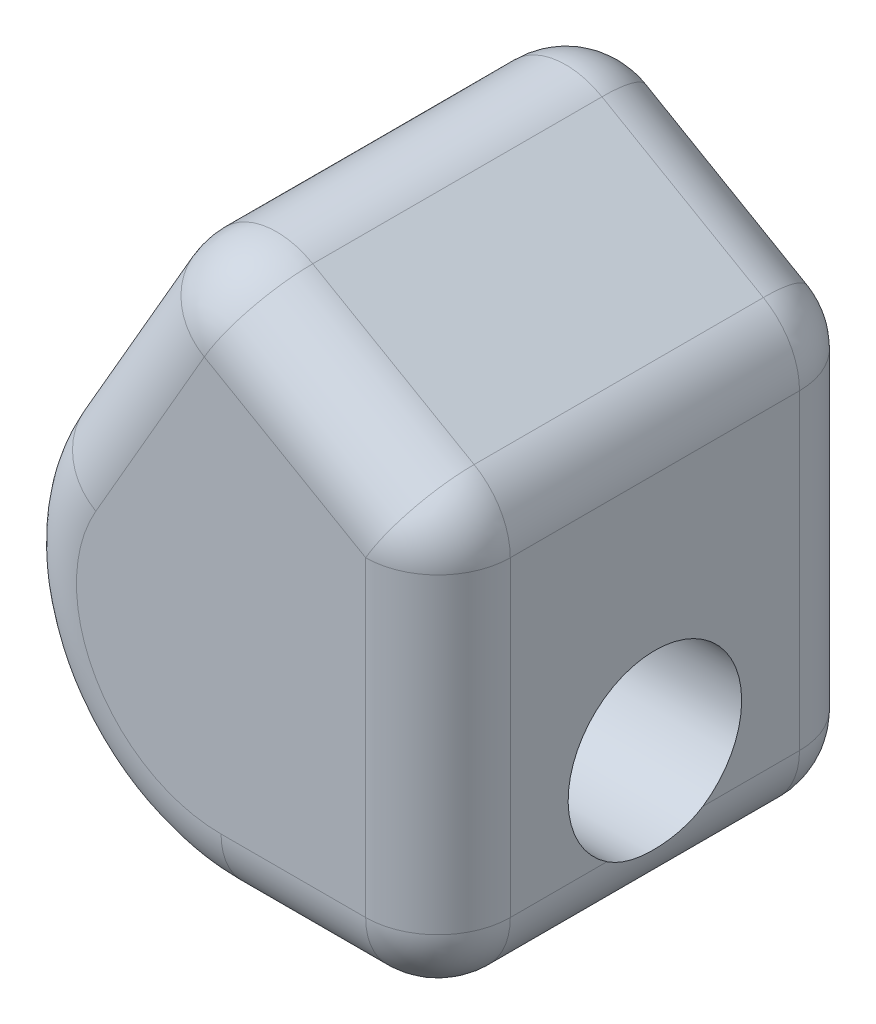
ISO-10303-21;
HEADER;
FILE_DESCRIPTION(('STEP AP214'),'2;1');
FILE_NAME('part.step','',(''),(''),'','','');
FILE_SCHEMA(('AUTOMOTIVE_DESIGN { 1 0 10303 214 1 1 1 1 }'));
ENDSEC;
DATA;
#1=APPLICATION_CONTEXT('core data for automotive mechanical design processes');
#2=APPLICATION_PROTOCOL_DEFINITION('international standard','automotive_design',2000,#1);
#3=PRODUCT_CONTEXT('',#1,'mechanical');
#4=PRODUCT('Part','Part','',(#3));
#5=PRODUCT_RELATED_PRODUCT_CATEGORY('part','',(#4));
#6=PRODUCT_DEFINITION_FORMATION('','',#4);
#7=PRODUCT_DEFINITION_CONTEXT('part definition',#1,'design');
#8=PRODUCT_DEFINITION('design','',#6,#7);
#9=PRODUCT_DEFINITION_SHAPE('','',#8);
#10=(LENGTH_UNIT() NAMED_UNIT(*) SI_UNIT(.MILLI.,.METRE.));
#11=(NAMED_UNIT(*) PLANE_ANGLE_UNIT() SI_UNIT($,.RADIAN.));
#12=(NAMED_UNIT(*) SI_UNIT($,.STERADIAN.) SOLID_ANGLE_UNIT());
#13=UNCERTAINTY_MEASURE_WITH_UNIT(LENGTH_MEASURE(1.E-05),#10,'distance_accuracy_value','');
#14=(GEOMETRIC_REPRESENTATION_CONTEXT(3) GLOBAL_UNCERTAINTY_ASSIGNED_CONTEXT((#13)) GLOBAL_UNIT_ASSIGNED_CONTEXT((#10,
#11,#12)) REPRESENTATION_CONTEXT('',''));
#15=CARTESIAN_POINT('',(0.,0.,0.));
#16=DIRECTION('',(0.,0.,1.));
#17=DIRECTION('',(1.,0.,0.));
#18=AXIS2_PLACEMENT_3D('',#15,#16,#17);
#19=CARTESIAN_POINT('',(172.607004545534,1.50000000000002,2.));
#20=DIRECTION('',(-0.866025403784435,0.500000000000006,0.));
#21=DIRECTION('',(-0.500000000000006,-0.866025403784435,0.));
#22=AXIS2_PLACEMENT_3D('',#19,#20,#21);
#23=PLANE('',#22);
#24=CARTESIAN_POINT('',(173.357004545534,2.79903810567669,0.));
#25=DIRECTION('',(-0.866025403784436,0.500000000000006,0.));
#26=DIRECTION('',(-0.500000000000006,-0.866025403784435,0.));
#27=AXIS2_PLACEMENT_3D('',#24,#25,#26);
#28=CIRCLE('',#27,1.7);
#29=CARTESIAN_POINT('',(172.607004545534,1.50000000000001,0.799999999999927));
#30=VERTEX_POINT('',#29);
#31=CARTESIAN_POINT('',(174.107004545535,4.09807621135337,0.799999999999952));
#32=VERTEX_POINT('',#31);
#33=EDGE_CURVE('E173',#30,#32,#28,.T.);
#34=ORIENTED_EDGE('',*,*,#33,.F.);
#35=DIRECTION('',(0.,0.,1.));
#36=VECTOR('',#35,1.);
#37=CARTESIAN_POINT('',(172.607004545534,1.50000000000002,-3.));
#38=LINE('',#37,#36);
#39=CARTESIAN_POINT('',(172.607004545534,1.50000000000002,2.));
#40=VERTEX_POINT('',#39);
#41=EDGE_CURVE('E316',#30,#40,#38,.T.);
#42=ORIENTED_EDGE('',*,*,#41,.T.);
#43=DIRECTION('',(-0.500000000000006,-0.866025403784435,0.));
#44=VECTOR('',#43,1.);
#45=CARTESIAN_POINT('',(128.805734356311,-74.366025403785,2.));
#46=LINE('',#45,#44);
#47=CARTESIAN_POINT('',(174.107004545534,4.09807621135337,2.));
#48=VERTEX_POINT('',#47);
#49=EDGE_CURVE('E354',#40,#48,#46,.F.);
#50=ORIENTED_EDGE('',*,*,#49,.T.);
#51=DIRECTION('',(0.,0.,1.));
#52=VECTOR('',#51,1.);
#53=CARTESIAN_POINT('',(174.107004545534,4.09807621135338,-3.));
#54=LINE('',#53,#52);
#55=EDGE_CURVE('E350',#48,#32,#54,.F.);
#56=ORIENTED_EDGE('',*,*,#55,.T.);
#57=EDGE_LOOP('',(#34,#42,#50,#56));
#58=FACE_BOUND('',#57,.T.);
#59=ADVANCED_FACE('F39',(#58),#23,.T.);
#60=CARTESIAN_POINT('',(177.205080756888,-2.99999999999999,2.));
#61=DIRECTION('',(0.,-1.,0.));
#62=DIRECTION('',(0.,0.,-1.));
#63=AXIS2_PLACEMENT_3D('',#60,#61,#62);
#64=PLANE('',#63);
#65=DIRECTION('',(0.,0.,1.));
#66=VECTOR('',#65,1.);
#67=CARTESIAN_POINT('',(175.205080756888,-2.99999999999999,-3.));
#68=LINE('',#67,#66);
#69=CARTESIAN_POINT('',(175.205080756888,-2.99999999999999,-2.));
#70=VERTEX_POINT('',#69);
#71=CARTESIAN_POINT('',(175.205080756888,-2.99999999999999,2.));
#72=VERTEX_POINT('',#71);
#73=EDGE_CURVE('E321',#70,#72,#68,.T.);
#74=ORIENTED_EDGE('',*,*,#73,.F.);
#75=DIRECTION('',(-1.,0.,0.));
#76=VECTOR('',#75,1.);
#77=CARTESIAN_POINT('',(0.,-2.99999999999999,-2.));
#78=LINE('',#77,#76);
#79=CARTESIAN_POINT('',(177.205080756888,-2.99999999999999,-2.));
#80=VERTEX_POINT('',#79);
#81=EDGE_CURVE('E347',#70,#80,#78,.F.);
#82=ORIENTED_EDGE('',*,*,#81,.T.);
#83=DIRECTION('',(0.,0.,1.));
#84=VECTOR('',#83,1.);
#85=CARTESIAN_POINT('',(177.205080756888,-2.99999999999999,3.));
#86=LINE('',#85,#84);
#87=CARTESIAN_POINT('',(177.205080756888,-2.99999999999999,2.));
#88=VERTEX_POINT('',#87);
#89=EDGE_CURVE('E343',#80,#88,#86,.T.);
#90=ORIENTED_EDGE('',*,*,#89,.T.);
#91=DIRECTION('',(-1.,0.,0.));
#92=VECTOR('',#91,1.);
#93=CARTESIAN_POINT('',(175.205080756888,-2.99999999999999,2.));
#94=LINE('',#93,#92);
#95=EDGE_CURVE('E345',#88,#72,#94,.T.);
#96=ORIENTED_EDGE('',*,*,#95,.T.);
#97=EDGE_LOOP('',(#74,#82,#90,#96));
#98=FACE_BOUND('',#97,.T.);
#99=ADVANCED_FACE('F41',(#98),#64,.T.);
#100=CARTESIAN_POINT('',(174.107004545535,4.09807621135337,-0.799999999999952));
#101=VERTEX_POINT('',#100);
#102=CARTESIAN_POINT('',(172.607004545534,1.50000000000002,-0.799999999999927));
#103=VERTEX_POINT('',#102);
#104=EDGE_CURVE('E177',#101,#103,#28,.T.);
#105=ORIENTED_EDGE('',*,*,#104,.F.);
#106=CARTESIAN_POINT('',(174.107004545534,4.09807621135337,-2.));
#107=VERTEX_POINT('',#106);
#108=EDGE_CURVE('E353',#101,#107,#54,.F.);
#109=ORIENTED_EDGE('',*,*,#108,.T.);
#110=DIRECTION('',(-0.500000000000006,-0.866025403784435,0.));
#111=VECTOR('',#110,1.);
#112=CARTESIAN_POINT('',(172.607004545534,1.50000000000004,-2.));
#113=LINE('',#112,#111);
#114=CARTESIAN_POINT('',(172.607004545534,1.50000000000002,-2.));
#115=VERTEX_POINT('',#114);
#116=EDGE_CURVE('E357',#107,#115,#113,.T.);
#117=ORIENTED_EDGE('',*,*,#116,.T.);
#118=EDGE_CURVE('E306',#115,#103,#38,.T.);
#119=ORIENTED_EDGE('',*,*,#118,.T.);
#120=EDGE_LOOP('',(#105,#109,#117,#119));
#121=FACE_BOUND('',#120,.T.);
#122=ADVANCED_FACE('F212',(#121),#23,.T.);
#123=CARTESIAN_POINT('',(177.205080756888,2.3094010767586,2.));
#124=DIRECTION('',(0.,0.,1.));
#125=DIRECTION('',(1.,0.,0.));
#126=AXIS2_PLACEMENT_3D('',#123,#124,#125);
#127=SPHERICAL_SURFACE('',#126,1.);
#128=CARTESIAN_POINT('',(177.205080756888,2.3094010767586,2.));
#129=DIRECTION('',(0.,0.,1.));
#130=DIRECTION('',(1.,0.,0.));
#131=AXIS2_PLACEMENT_3D('',#128,#129,#130);
#132=CIRCLE('',#131,1.);
#133=CARTESIAN_POINT('',(177.705080756888,3.17542648054303,2.));
#134=VERTEX_POINT('',#133);
#135=CARTESIAN_POINT('',(178.205080756888,2.3094010767586,2.));
#136=VERTEX_POINT('',#135);
#137=EDGE_CURVE('E437',#134,#136,#132,.F.);
#138=ORIENTED_EDGE('',*,*,#137,.F.);
#139=CARTESIAN_POINT('',(177.205080756888,2.30940107675859,2.));
#140=DIRECTION('',(0.866025403784439,-0.499999999999999,0.));
#141=DIRECTION('',(0.5,0.866025403784439,0.));
#142=AXIS2_PLACEMENT_3D('',#139,#140,#141);
#143=CIRCLE('',#142,1.);
#144=CARTESIAN_POINT('',(177.205080756888,2.3094010767586,3.));
#145=VERTEX_POINT('',#144);
#146=EDGE_CURVE('E315',#145,#134,#143,.F.);
#147=ORIENTED_EDGE('',*,*,#146,.F.);
#148=CARTESIAN_POINT('',(177.205080756888,2.3094010767586,2.));
#149=DIRECTION('',(0.,1.,0.));
#150=DIRECTION('',(-1.,0.,0.));
#151=AXIS2_PLACEMENT_3D('',#148,#149,#150);
#152=CIRCLE('',#151,1.);
#153=EDGE_CURVE('E440',#136,#145,#152,.F.);
#154=ORIENTED_EDGE('',*,*,#153,.F.);
#155=EDGE_LOOP('',(#138,#147,#154));
#156=FACE_BOUND('',#155,.T.);
#157=ADVANCED_FACE('F220',(#156),#127,.T.);
#158=CARTESIAN_POINT('',(177.205080756888,2.3094010767586,-2.));
#159=DIRECTION('',(0.,0.,1.));
#160=DIRECTION('',(1.,0.,0.));
#161=AXIS2_PLACEMENT_3D('',#158,#159,#160);
#162=SPHERICAL_SURFACE('',#161,1.);
#163=CARTESIAN_POINT('',(177.205080756888,2.3094010767586,-2.));
#164=DIRECTION('',(0.,1.,0.));
#165=DIRECTION('',(0.,0.,1.));
#166=AXIS2_PLACEMENT_3D('',#163,#164,#165);
#167=CIRCLE('',#166,1.);
#168=CARTESIAN_POINT('',(177.205080756888,2.30940107675861,-3.));
#169=VERTEX_POINT('',#168);
#170=CARTESIAN_POINT('',(178.205080756888,2.3094010767586,-2.));
#171=VERTEX_POINT('',#170);
#172=EDGE_CURVE('E412',#169,#171,#167,.F.);
#173=ORIENTED_EDGE('',*,*,#172,.F.);
#174=CARTESIAN_POINT('',(177.205080756888,2.30940107675861,-2.));
#175=DIRECTION('',(0.866025403784435,-0.500000000000006,0.));
#176=DIRECTION('',(0.500000000000007,0.866025403784435,0.));
#177=AXIS2_PLACEMENT_3D('',#174,#175,#176);
#178=CIRCLE('',#177,1.);
#179=CARTESIAN_POINT('',(177.705080756888,3.17542648054303,-2.));
#180=VERTEX_POINT('',#179);
#181=EDGE_CURVE('E420',#180,#169,#178,.F.);
#182=ORIENTED_EDGE('',*,*,#181,.F.);
#183=CARTESIAN_POINT('',(177.205080756888,2.30940107675859,-2.));
#184=DIRECTION('',(0.,0.,-1.));
#185=DIRECTION('',(-1.,0.,0.));
#186=AXIS2_PLACEMENT_3D('',#183,#184,#185);
#187=CIRCLE('',#186,1.);
#188=EDGE_CURVE('E423',#180,#171,#187,.T.);
#189=ORIENTED_EDGE('',*,*,#188,.T.);
#190=EDGE_LOOP('',(#173,#182,#189));
#191=FACE_BOUND('',#190,.T.);
#192=ADVANCED_FACE('F223',(#191),#162,.T.);
#193=CARTESIAN_POINT('',(177.205080756888,2.3094010767586,-3.));
#194=DIRECTION('',(0.,0.,-1.));
#195=DIRECTION('',(-1.,0.,0.));
#196=AXIS2_PLACEMENT_3D('',#193,#194,#195);
#197=CYLINDRICAL_SURFACE('',#196,1.);
#198=ORIENTED_EDGE('',*,*,#137,.T.);
#199=DIRECTION('',(0.,0.,1.));
#200=VECTOR('',#199,1.);
#201=CARTESIAN_POINT('',(178.205080756888,2.3094010767586,3.));
#202=LINE('',#201,#200);
#203=EDGE_CURVE('E371',#171,#136,#202,.T.);
#204=ORIENTED_EDGE('',*,*,#203,.F.);
#205=ORIENTED_EDGE('',*,*,#188,.F.);
#206=DIRECTION('',(0.,0.,1.));
#207=VECTOR('',#206,1.);
#208=CARTESIAN_POINT('',(177.705080756888,3.17542648054303,-3.));
#209=LINE('',#208,#207);
#210=EDGE_CURVE('E386',#134,#180,#209,.F.);
#211=ORIENTED_EDGE('',*,*,#210,.F.);
#212=EDGE_LOOP('',(#198,#204,#205,#211));
#213=FACE_BOUND('',#212,.T.);
#214=ADVANCED_FACE('F229',(#213),#197,.T.);
#215=CARTESIAN_POINT('',(45.3012701892214,78.4641016151375,2.));
#216=DIRECTION('',(-0.866025403784441,0.499999999999997,0.));
#217=DIRECTION('',(-0.499999999999997,-0.86602540378444,0.));
#218=AXIS2_PLACEMENT_3D('',#215,#216,#217);
#219=CYLINDRICAL_SURFACE('',#218,1.);
#220=ORIENTED_EDGE('',*,*,#146,.T.);
#221=DIRECTION('',(0.866025403784441,-0.499999999999997,0.));
#222=VECTOR('',#221,1.);
#223=CARTESIAN_POINT('',(178.205080756888,2.88675134594822,2.));
#224=LINE('',#223,#222);
#225=CARTESIAN_POINT('',(175.473029949319,4.46410161513779,2.));
#226=VERTEX_POINT('',#225);
#227=EDGE_CURVE('E384',#226,#134,#224,.T.);
#228=ORIENTED_EDGE('',*,*,#227,.F.);
#229=CARTESIAN_POINT('',(174.973029949319,3.59807621135336,2.));
#230=DIRECTION('',(-0.866025403784434,0.500000000000007,0.));
#231=DIRECTION('',(-0.500000000000007,-0.866025403784434,0.));
#232=AXIS2_PLACEMENT_3D('',#229,#230,#231);
#233=CIRCLE('',#232,1.);
#234=CARTESIAN_POINT('',(174.973029949319,3.59807621135336,3.));
#235=VERTEX_POINT('',#234);
#236=EDGE_CURVE('E434',#235,#226,#233,.T.);
#237=ORIENTED_EDGE('',*,*,#236,.F.);
#238=DIRECTION('',(0.866025403784441,-0.499999999999997,0.));
#239=VECTOR('',#238,1.);
#240=CARTESIAN_POINT('',(174.107004545535,4.09807621135334,3.));
#241=LINE('',#240,#239);
#242=EDGE_CURVE('E360',#145,#235,#241,.F.);
#243=ORIENTED_EDGE('',*,*,#242,.F.);
#244=EDGE_LOOP('',(#220,#228,#237,#243));
#245=FACE_BOUND('',#244,.T.);
#246=ADVANCED_FACE('F225',(#245),#219,.T.);
#247=CARTESIAN_POINT('',(177.205080756888,0.,2.));
#248=DIRECTION('',(0.,1.,0.));
#249=DIRECTION('',(0.,0.,1.));
#250=AXIS2_PLACEMENT_3D('',#247,#248,#249);
#251=CYLINDRICAL_SURFACE('',#250,1.);
#252=ORIENTED_EDGE('',*,*,#153,.T.);
#253=DIRECTION('',(0.,1.,0.));
#254=VECTOR('',#253,1.);
#255=CARTESIAN_POINT('',(177.205080756888,0.,3.));
#256=LINE('',#255,#254);
#257=CARTESIAN_POINT('',(177.205080756888,-1.99999999999999,3.));
#258=VERTEX_POINT('',#257);
#259=EDGE_CURVE('E362',#258,#145,#256,.T.);
#260=ORIENTED_EDGE('',*,*,#259,.F.);
#261=CARTESIAN_POINT('',(177.205080756888,-1.99999999999999,2.));
#262=DIRECTION('',(0.,-1.,0.));
#263=DIRECTION('',(0.,0.,-1.));
#264=AXIS2_PLACEMENT_3D('',#261,#262,#263);
#265=CIRCLE('',#264,1.);
#266=CARTESIAN_POINT('',(178.205080756888,-1.99999999999999,2.));
#267=VERTEX_POINT('',#266);
#268=EDGE_CURVE('E426',#267,#258,#265,.T.);
#269=ORIENTED_EDGE('',*,*,#268,.F.);
#270=DIRECTION('',(0.,1.,0.));
#271=VECTOR('',#270,1.);
#272=CARTESIAN_POINT('',(178.205080756888,0.,2.));
#273=LINE('',#272,#271);
#274=EDGE_CURVE('E373',#136,#267,#273,.F.);
#275=ORIENTED_EDGE('',*,*,#274,.F.);
#276=EDGE_LOOP('',(#252,#260,#269,#275));
#277=FACE_BOUND('',#276,.T.);
#278=ADVANCED_FACE('F228',(#277),#251,.T.);
#279=CARTESIAN_POINT('',(45.3012701892214,78.4641016151375,-2.));
#280=DIRECTION('',(0.866025403784441,-0.499999999999997,0.));
#281=DIRECTION('',(0.499999999999997,0.86602540378444,0.));
#282=AXIS2_PLACEMENT_3D('',#279,#280,#281);
#283=CYLINDRICAL_SURFACE('',#282,1.);
#284=ORIENTED_EDGE('',*,*,#181,.T.);
#285=DIRECTION('',(0.866025403784441,-0.499999999999997,0.));
#286=VECTOR('',#285,1.);
#287=CARTESIAN_POINT('',(45.3012701892214,78.4641016151375,-3.));
#288=LINE('',#287,#286);
#289=CARTESIAN_POINT('',(174.973029949319,3.59807621135338,-3.));
#290=VERTEX_POINT('',#289);
#291=EDGE_CURVE('E330',#290,#169,#288,.T.);
#292=ORIENTED_EDGE('',*,*,#291,.F.);
#293=CARTESIAN_POINT('',(174.973029949319,3.59807621135334,-2.));
#294=DIRECTION('',(-0.866025403784439,0.499999999999999,0.));
#295=DIRECTION('',(-0.5,-0.866025403784439,0.));
#296=AXIS2_PLACEMENT_3D('',#293,#294,#295);
#297=CIRCLE('',#296,1.);
#298=CARTESIAN_POINT('',(175.473029949319,4.46410161513779,-2.));
#299=VERTEX_POINT('',#298);
#300=EDGE_CURVE('E409',#299,#290,#297,.T.);
#301=ORIENTED_EDGE('',*,*,#300,.F.);
#302=DIRECTION('',(0.866025403784441,-0.499999999999997,0.));
#303=VECTOR('',#302,1.);
#304=CARTESIAN_POINT('',(45.8012701892214,79.3301270189219,-2.));
#305=LINE('',#304,#303);
#306=EDGE_CURVE('E175',#180,#299,#305,.F.);
#307=ORIENTED_EDGE('',*,*,#306,.F.);
#308=EDGE_LOOP('',(#284,#292,#301,#307));
#309=FACE_BOUND('',#308,.T.);
#310=ADVANCED_FACE('F240',(#309),#283,.T.);
#311=CARTESIAN_POINT('',(177.205080756888,0.,-2.));
#312=DIRECTION('',(0.,-1.,0.));
#313=DIRECTION('',(0.,0.,-1.));
#314=AXIS2_PLACEMENT_3D('',#311,#312,#313);
#315=CYLINDRICAL_SURFACE('',#314,1.);
#316=ORIENTED_EDGE('',*,*,#172,.T.);
#317=DIRECTION('',(0.,1.,0.));
#318=VECTOR('',#317,1.);
#319=CARTESIAN_POINT('',(178.205080756888,2.88675134594822,-2.));
#320=LINE('',#319,#318);
#321=CARTESIAN_POINT('',(178.205080756888,-1.99999999999999,-2.));
#322=VERTEX_POINT('',#321);
#323=EDGE_CURVE('E379',#322,#171,#320,.T.);
#324=ORIENTED_EDGE('',*,*,#323,.F.);
#325=CARTESIAN_POINT('',(177.205080756888,-1.99999999999999,-2.));
#326=DIRECTION('',(0.,-1.,0.));
#327=DIRECTION('',(0.,0.,-1.));
#328=AXIS2_PLACEMENT_3D('',#325,#326,#327);
#329=CIRCLE('',#328,1.);
#330=CARTESIAN_POINT('',(177.205080756888,-1.99999999999999,-3.));
#331=VERTEX_POINT('',#330);
#332=EDGE_CURVE('E401',#331,#322,#329,.T.);
#333=ORIENTED_EDGE('',*,*,#332,.F.);
#334=DIRECTION('',(0.,1.,0.));
#335=VECTOR('',#334,1.);
#336=CARTESIAN_POINT('',(177.205080756888,-2.99999999999999,-3.));
#337=LINE('',#336,#335);
#338=EDGE_CURVE('E332',#169,#331,#337,.F.);
#339=ORIENTED_EDGE('',*,*,#338,.F.);
#340=EDGE_LOOP('',(#316,#324,#333,#339));
#341=FACE_BOUND('',#340,.T.);
#342=ADVANCED_FACE('F260',(#341),#315,.T.);
#343=CARTESIAN_POINT('',(0.,0.,3.));
#344=DIRECTION('',(0.,0.,1.));
#345=DIRECTION('',(1.,0.,0.));
#346=AXIS2_PLACEMENT_3D('',#343,#344,#345);
#347=PLANE('',#346);
#348=CARTESIAN_POINT('',(175.205080756888,0.,3.));
#349=DIRECTION('',(0.,0.,1.));
#350=DIRECTION('',(1.,0.,0.));
#351=AXIS2_PLACEMENT_3D('',#348,#349,#350);
#352=CIRCLE('',#351,2.00000000000001);
#353=CARTESIAN_POINT('',(173.473029949319,1.,3.));
#354=VERTEX_POINT('',#353);
#355=CARTESIAN_POINT('',(175.205080756888,-2.,3.));
#356=VERTEX_POINT('',#355);
#357=EDGE_CURVE('E366',#354,#356,#352,.T.);
#358=ORIENTED_EDGE('',*,*,#357,.T.);
#359=DIRECTION('',(-1.,0.,0.));
#360=VECTOR('',#359,1.);
#361=CARTESIAN_POINT('',(178.205080756888,-1.99999999999999,3.));
#362=LINE('',#361,#360);
#363=EDGE_CURVE('E368',#356,#258,#362,.F.);
#364=ORIENTED_EDGE('',*,*,#363,.T.);
#365=ORIENTED_EDGE('',*,*,#259,.T.);
#366=ORIENTED_EDGE('',*,*,#242,.T.);
#367=DIRECTION('',(-0.500000000000006,-0.866025403784435,0.));
#368=VECTOR('',#367,1.);
#369=CARTESIAN_POINT('',(129.671759760096,-74.866025403785,3.));
#370=LINE('',#369,#368);
#371=EDGE_CURVE('E364',#235,#354,#370,.T.);
#372=ORIENTED_EDGE('',*,*,#371,.T.);
#373=EDGE_LOOP('',(#358,#364,#365,#366,#372));
#374=FACE_BOUND('',#373,.T.);
#375=ADVANCED_FACE('F254',(#374),#347,.T.);
#376=CARTESIAN_POINT('',(177.205080756888,-1.99999999999999,2.));
#377=DIRECTION('',(0.,0.,1.));
#378=DIRECTION('',(1.,0.,0.));
#379=AXIS2_PLACEMENT_3D('',#376,#377,#378);
#380=SPHERICAL_SURFACE('',#379,1.);
#381=ORIENTED_EDGE('',*,*,#268,.T.);
#382=CARTESIAN_POINT('',(177.205080756888,-1.99999999999999,2.));
#383=DIRECTION('',(1.,0.,0.));
#384=DIRECTION('',(0.,0.,-1.));
#385=AXIS2_PLACEMENT_3D('',#382,#383,#384);
#386=CIRCLE('',#385,1.);
#387=EDGE_CURVE('E428',#258,#88,#386,.T.);
#388=ORIENTED_EDGE('',*,*,#387,.T.);
#389=CARTESIAN_POINT('',(177.205080756888,-1.99999999999999,2.));
#390=DIRECTION('',(0.,0.,1.));
#391=DIRECTION('',(1.,0.,0.));
#392=AXIS2_PLACEMENT_3D('',#389,#390,#391);
#393=CIRCLE('',#392,1.);
#394=EDGE_CURVE('E414',#267,#88,#393,.F.);
#395=ORIENTED_EDGE('',*,*,#394,.F.);
#396=EDGE_LOOP('',(#381,#388,#395));
#397=FACE_BOUND('',#396,.T.);
#398=ADVANCED_FACE('F250',(#397),#380,.T.);
#399=CARTESIAN_POINT('',(178.205080756888,0.,-3.));
#400=DIRECTION('',(1.,0.,0.));
#401=DIRECTION('',(0.,0.,-1.));
#402=AXIS2_PLACEMENT_3D('',#399,#400,#401);
#403=PLANE('',#402);
#404=CARTESIAN_POINT('',(178.205080756888,-0.999999999999993,0.));
#405=DIRECTION('',(1.,0.,0.));
#406=DIRECTION('',(0.,0.,-1.));
#407=AXIS2_PLACEMENT_3D('',#404,#405,#406);
#408=CIRCLE('',#407,1.2);
#409=CARTESIAN_POINT('',(178.205080756888,-1.99999999999999,-0.66332495807108));
#410=VERTEX_POINT('',#409);
#411=CARTESIAN_POINT('',(178.205080756888,-1.99999999999999,0.66332495807108));
#412=VERTEX_POINT('',#411);
#413=EDGE_CURVE('E53',#410,#412,#408,.T.);
#414=ORIENTED_EDGE('',*,*,#413,.F.);
#415=DIRECTION('',(0.,0.,1.));
#416=VECTOR('',#415,1.);
#417=CARTESIAN_POINT('',(178.205080756888,-1.99999999999999,-3.));
#418=LINE('',#417,#416);
#419=EDGE_CURVE('E378',#410,#322,#418,.F.);
#420=ORIENTED_EDGE('',*,*,#419,.T.);
#421=ORIENTED_EDGE('',*,*,#323,.T.);
#422=ORIENTED_EDGE('',*,*,#203,.T.);
#423=ORIENTED_EDGE('',*,*,#274,.T.);
#424=EDGE_CURVE('E375',#267,#412,#418,.F.);
#425=ORIENTED_EDGE('',*,*,#424,.T.);
#426=EDGE_LOOP('',(#414,#420,#421,#422,#423,#425));
#427=FACE_BOUND('',#426,.T.);
#428=ADVANCED_FACE('F253',(#427),#403,.T.);
#429=CARTESIAN_POINT('',(0.,0.,-3.));
#430=DIRECTION('',(0.,0.,1.));
#431=DIRECTION('',(1.,0.,0.));
#432=AXIS2_PLACEMENT_3D('',#429,#430,#431);
#433=PLANE('',#432);
#434=DIRECTION('',(-1.,0.,0.));
#435=VECTOR('',#434,1.);
#436=CARTESIAN_POINT('',(0.,-1.99999999999999,-3.));
#437=LINE('',#436,#435);
#438=CARTESIAN_POINT('',(175.205080756888,-1.99999999999999,-3.));
#439=VERTEX_POINT('',#438);
#440=EDGE_CURVE('E338',#331,#439,#437,.T.);
#441=ORIENTED_EDGE('',*,*,#440,.T.);
#442=CARTESIAN_POINT('',(175.205080756888,0.,-3.));
#443=DIRECTION('',(0.,0.,1.));
#444=DIRECTION('',(1.,0.,0.));
#445=AXIS2_PLACEMENT_3D('',#442,#443,#444);
#446=CIRCLE('',#445,2.00000000000001);
#447=CARTESIAN_POINT('',(173.473029949319,1.00000000000002,-3.));
#448=VERTEX_POINT('',#447);
#449=EDGE_CURVE('E340',#439,#448,#446,.F.);
#450=ORIENTED_EDGE('',*,*,#449,.T.);
#451=DIRECTION('',(-0.500000000000006,-0.866025403784435,0.));
#452=VECTOR('',#451,1.);
#453=CARTESIAN_POINT('',(175.473029949319,4.46410161513781,-3.));
#454=LINE('',#453,#452);
#455=EDGE_CURVE('E336',#448,#290,#454,.F.);
#456=ORIENTED_EDGE('',*,*,#455,.T.);
#457=ORIENTED_EDGE('',*,*,#291,.T.);
#458=ORIENTED_EDGE('',*,*,#338,.T.);
#459=EDGE_LOOP('',(#441,#450,#456,#457,#458));
#460=FACE_BOUND('',#459,.T.);
#461=ADVANCED_FACE('F292',(#460),#433,.F.);
#462=CARTESIAN_POINT('',(175.205080756888,0.,-2.));
#463=DIRECTION('',(0.,0.,1.));
#464=DIRECTION('',(1.,0.,0.));
#465=AXIS2_PLACEMENT_3D('',#462,#463,#464);
#466=TOROIDAL_SURFACE('',#465,2.00000000000001,1.);
#467=CARTESIAN_POINT('',(173.473029949319,1.00000000000001,-2.));
#468=DIRECTION('',(-0.500000000000003,-0.866025403784437,0.));
#469=DIRECTION('',(0.866025403784437,-0.500000000000003,0.));
#470=AXIS2_PLACEMENT_3D('',#467,#468,#469);
#471=CIRCLE('',#470,1.);
#472=EDGE_CURVE('E393',#115,#448,#471,.T.);
#473=ORIENTED_EDGE('',*,*,#472,.T.);
#474=ORIENTED_EDGE('',*,*,#449,.F.);
#475=CARTESIAN_POINT('',(175.205080756888,-1.99999999999999,-2.));
#476=DIRECTION('',(-1.,0.,0.));
#477=DIRECTION('',(0.,0.,1.));
#478=AXIS2_PLACEMENT_3D('',#475,#476,#477);
#479=CIRCLE('',#478,1.);
#480=EDGE_CURVE('E390',#439,#70,#479,.T.);
#481=ORIENTED_EDGE('',*,*,#480,.T.);
#482=CARTESIAN_POINT('',(175.205080756888,0.,-2.));
#483=DIRECTION('',(0.,0.,1.));
#484=DIRECTION('',(1.,0.,0.));
#485=AXIS2_PLACEMENT_3D('',#482,#483,#484);
#486=CIRCLE('',#485,3.00000000000001);
#487=EDGE_CURVE('E327',#115,#70,#486,.T.);
#488=ORIENTED_EDGE('',*,*,#487,.F.);
#489=EDGE_LOOP('',(#473,#474,#481,#488));
#490=FACE_BOUND('',#489,.T.);
#491=ADVANCED_FACE('F282',(#490),#466,.T.);
#492=CARTESIAN_POINT('',(177.205080756888,-1.99999999999999,-2.));
#493=DIRECTION('',(0.,0.,1.));
#494=DIRECTION('',(1.,0.,0.));
#495=AXIS2_PLACEMENT_3D('',#492,#493,#494);
#496=SPHERICAL_SURFACE('',#495,1.);
#497=ORIENTED_EDGE('',*,*,#332,.T.);
#498=CARTESIAN_POINT('',(177.205080756888,-1.99999999999999,-2.));
#499=DIRECTION('',(0.,0.,-1.));
#500=DIRECTION('',(-1.,0.,0.));
#501=AXIS2_PLACEMENT_3D('',#498,#499,#500);
#502=CIRCLE('',#501,1.);
#503=EDGE_CURVE('E404',#322,#80,#502,.T.);
#504=ORIENTED_EDGE('',*,*,#503,.T.);
#505=CARTESIAN_POINT('',(177.205080756888,-1.99999999999999,-2.));
#506=DIRECTION('',(1.,0.,0.));
#507=DIRECTION('',(0.,0.,-1.));
#508=AXIS2_PLACEMENT_3D('',#505,#506,#507);
#509=CIRCLE('',#508,1.);
#510=EDGE_CURVE('E395',#331,#80,#509,.F.);
#511=ORIENTED_EDGE('',*,*,#510,.F.);
#512=EDGE_LOOP('',(#497,#504,#511));
#513=FACE_BOUND('',#512,.T.);
#514=ADVANCED_FACE('F279',(#513),#496,.T.);
#515=CARTESIAN_POINT('',(0.,-1.99999999999999,-2.));
#516=DIRECTION('',(-1.,0.,0.));
#517=DIRECTION('',(0.,0.,1.));
#518=AXIS2_PLACEMENT_3D('',#515,#516,#517);
#519=CYLINDRICAL_SURFACE('',#518,1.);
#520=ORIENTED_EDGE('',*,*,#510,.T.);
#521=ORIENTED_EDGE('',*,*,#81,.F.);
#522=ORIENTED_EDGE('',*,*,#480,.F.);
#523=ORIENTED_EDGE('',*,*,#440,.F.);
#524=EDGE_LOOP('',(#520,#521,#522,#523));
#525=FACE_BOUND('',#524,.T.);
#526=ADVANCED_FACE('F277',(#525),#519,.T.);
#527=CARTESIAN_POINT('',(174.973029949319,3.59807621135337,-2.));
#528=DIRECTION('',(0.,0.,1.));
#529=DIRECTION('',(1.,0.,0.));
#530=AXIS2_PLACEMENT_3D('',#527,#528,#529);
#531=SPHERICAL_SURFACE('',#530,1.);
#532=CARTESIAN_POINT('',(174.973029949319,3.59807621135337,-2.));
#533=DIRECTION('',(0.,0.,-1.));
#534=DIRECTION('',(-1.,0.,0.));
#535=AXIS2_PLACEMENT_3D('',#532,#533,#534);
#536=CIRCLE('',#535,1.);
#537=EDGE_CURVE('E407',#107,#299,#536,.T.);
#538=ORIENTED_EDGE('',*,*,#537,.T.);
#539=ORIENTED_EDGE('',*,*,#300,.T.);
#540=CARTESIAN_POINT('',(174.973029949319,3.59807621135338,-2.));
#541=DIRECTION('',(0.499999999999991,0.866025403784444,0.));
#542=DIRECTION('',(-0.866025403784444,0.499999999999991,0.));
#543=AXIS2_PLACEMENT_3D('',#540,#541,#542);
#544=CIRCLE('',#543,1.);
#545=EDGE_CURVE('E398',#107,#290,#544,.F.);
#546=ORIENTED_EDGE('',*,*,#545,.F.);
#547=EDGE_LOOP('',(#538,#539,#546));
#548=FACE_BOUND('',#547,.T.);
#549=ADVANCED_FACE('F274',(#548),#531,.T.);
#550=CARTESIAN_POINT('',(129.671759760096,-74.866025403785,-2.));
#551=DIRECTION('',(0.500000000000006,0.866025403784435,0.));
#552=DIRECTION('',(-0.866025403784435,0.500000000000006,0.));
#553=AXIS2_PLACEMENT_3D('',#550,#551,#552);
#554=CYLINDRICAL_SURFACE('',#553,1.);
#555=ORIENTED_EDGE('',*,*,#545,.T.);
#556=ORIENTED_EDGE('',*,*,#455,.F.);
#557=ORIENTED_EDGE('',*,*,#472,.F.);
#558=ORIENTED_EDGE('',*,*,#116,.F.);
#559=EDGE_LOOP('',(#555,#556,#557,#558));
#560=FACE_BOUND('',#559,.T.);
#561=ADVANCED_FACE('F269',(#560),#554,.T.);
#562=CARTESIAN_POINT('',(177.205080756888,-1.99999999999999,-3.));
#563=DIRECTION('',(0.,0.,-1.));
#564=DIRECTION('',(-1.,0.,0.));
#565=AXIS2_PLACEMENT_3D('',#562,#563,#564);
#566=CYLINDRICAL_SURFACE('',#565,1.);
#567=CARTESIAN_POINT('',(178.205080756888,-1.99999999999999,0.66332495807108));
#568=CARTESIAN_POINT('',(178.2050746898,-2.01856215136733,0.635347104865767));
#569=CARTESIAN_POINT('',(178.204563851078,-2.03593925986199,0.606595325866814));
#570=CARTESIAN_POINT('',(178.202883805427,-2.06821477926547,0.547759810452854));
#571=CARTESIAN_POINT('',(178.201714777443,-2.08311386246128,0.517676438111897));
#572=CARTESIAN_POINT('',(178.199069099135,-2.11033537815269,0.456377168655561));
#573=CARTESIAN_POINT('',(178.197592438476,-2.12265772404919,0.425161233518326));
#574=CARTESIAN_POINT('',(178.194625747384,-2.14464612723728,0.361816050831993));
#575=CARTESIAN_POINT('',(178.193135716363,-2.15431206689705,0.329686762907015));
#576=CARTESIAN_POINT('',(178.189040199752,-2.17921738399411,0.232232647890777));
#577=CARTESIAN_POINT('',(178.186806521806,-2.19038469278079,0.165795459334394));
#578=CARTESIAN_POINT('',(178.184595913353,-2.20144951738352,0.0320153299910163));
#579=CARTESIAN_POINT('',(178.184617676218,-2.20135355825634,-0.0353270637795306));
#580=CARTESIAN_POINT('',(178.186884319262,-2.18998204044842,-0.168423679810103));
#581=CARTESIAN_POINT('',(178.189109902338,-2.17880352191078,-0.234186613435949));
#582=CARTESIAN_POINT('',(178.194544867225,-2.14573364415568,-0.362912178403196));
#583=CARTESIAN_POINT('',(178.197753820194,-2.12384695222226,-0.42587601673246));
#584=CARTESIAN_POINT('',(178.201699862185,-2.08327788493531,-0.517344652398636));
#585=CARTESIAN_POINT('',(178.202875677104,-2.06833452930453,-0.547535647688186));
#586=CARTESIAN_POINT('',(178.204563168424,-2.0359883683269,-0.606511643055702));
#587=CARTESIAN_POINT('',(178.205076131727,-2.0185904016196,-0.635299262802457));
#588=CARTESIAN_POINT('',(178.205080756888,-1.99999999999999,-0.663324958071079));
#589=B_SPLINE_CURVE_WITH_KNOTS('',3,(#567,#568,#569,#570,#571,#572,#573,#574,#575,#576,#577,
#578,#579,#580,#581,#582,#583,#584,#585,#586,#587,#588),.UNSPECIFIED.,.F.,.F.,(4,2,2,2,2,2,2,2,
2,2,4),(0.,0.100678436174196,0.201329513628923,0.301983973225766,0.402642889317151,
0.603811072468582,0.804862715079165,1.00416933751295,1.20338916708361,1.30440219434106,
1.40521881229671),.UNSPECIFIED.);
#590=EDGE_CURVE('E161',#412,#410,#589,.T.);
#591=ORIENTED_EDGE('',*,*,#590,.F.);
#592=ORIENTED_EDGE('',*,*,#424,.F.);
#593=ORIENTED_EDGE('',*,*,#394,.T.);
#594=ORIENTED_EDGE('',*,*,#89,.F.);
#595=ORIENTED_EDGE('',*,*,#503,.F.);
#596=ORIENTED_EDGE('',*,*,#419,.F.);
#597=EDGE_LOOP('',(#591,#592,#593,#594,#595,#596));
#598=FACE_BOUND('',#597,.T.);
#599=ADVANCED_FACE('F265',(#598),#566,.T.);
#600=CARTESIAN_POINT('',(45.8012701892214,79.3301270189219,-3.));
#601=DIRECTION('',(-0.499999999999997,-0.86602540378444,0.));
#602=DIRECTION('',(0.866025403784441,-0.499999999999997,0.));
#603=AXIS2_PLACEMENT_3D('',#600,#601,#602);
#604=PLANE('',#603);
#605=ORIENTED_EDGE('',*,*,#210,.T.);
#606=ORIENTED_EDGE('',*,*,#306,.T.);
#607=DIRECTION('',(0.,0.,1.));
#608=VECTOR('',#607,1.);
#609=CARTESIAN_POINT('',(175.473029949319,4.4641016151378,3.));
#610=LINE('',#609,#608);
#611=EDGE_CURVE('E382',#299,#226,#610,.T.);
#612=ORIENTED_EDGE('',*,*,#611,.T.);
#613=ORIENTED_EDGE('',*,*,#227,.T.);
#614=EDGE_LOOP('',(#605,#606,#612,#613));
#615=FACE_BOUND('',#614,.T.);
#616=ADVANCED_FACE('F248',(#615),#604,.F.);
#617=CARTESIAN_POINT('',(174.973029949319,3.59807621135337,2.));
#618=DIRECTION('',(0.,0.,1.));
#619=DIRECTION('',(1.,0.,0.));
#620=AXIS2_PLACEMENT_3D('',#617,#618,#619);
#621=SPHERICAL_SURFACE('',#620,1.);
#622=CARTESIAN_POINT('',(174.973029949319,3.59807621135337,2.));
#623=DIRECTION('',(0.500000000000002,0.866025403784437,0.));
#624=DIRECTION('',(-0.866025403784437,0.500000000000003,0.));
#625=AXIS2_PLACEMENT_3D('',#622,#623,#624);
#626=CIRCLE('',#625,1.);
#627=EDGE_CURVE('E431',#48,#235,#626,.T.);
#628=ORIENTED_EDGE('',*,*,#627,.T.);
#629=ORIENTED_EDGE('',*,*,#236,.T.);
#630=CARTESIAN_POINT('',(174.973029949319,3.59807621135335,2.));
#631=DIRECTION('',(0.,0.,1.));
#632=DIRECTION('',(1.,0.,0.));
#633=AXIS2_PLACEMENT_3D('',#630,#631,#632);
#634=CIRCLE('',#633,1.);
#635=EDGE_CURVE('E417',#48,#226,#634,.F.);
#636=ORIENTED_EDGE('',*,*,#635,.F.);
#637=EDGE_LOOP('',(#628,#629,#636));
#638=FACE_BOUND('',#637,.T.);
#639=ADVANCED_FACE('F245',(#638),#621,.T.);
#640=CARTESIAN_POINT('',(174.973029949319,3.59807621135336,-3.));
#641=DIRECTION('',(0.,0.,-1.));
#642=DIRECTION('',(-1.,0.,0.));
#643=AXIS2_PLACEMENT_3D('',#640,#641,#642);
#644=CYLINDRICAL_SURFACE('',#643,1.);
#645=CARTESIAN_POINT('',(174.107004545534,4.09807621135336,0.799999999999997));
#646=CARTESIAN_POINT('',(174.116976996865,4.11532836389432,0.762643212308181));
#647=CARTESIAN_POINT('',(174.126744926069,4.13107583313541,0.724547826775369));
#648=CARTESIAN_POINT('',(174.145455150863,4.15969674988949,0.647106874379963));
#649=CARTESIAN_POINT('',(174.154397676042,4.17257099801312,0.607761659276416));
#650=CARTESIAN_POINT('',(174.171040646205,4.19558215338793,0.528055153701722));
#651=CARTESIAN_POINT('',(174.178741964605,4.20572098891827,0.487694601031702));
#652=CARTESIAN_POINT('',(174.192577885657,4.22339282020444,0.406138383714788));
#653=CARTESIAN_POINT('',(174.198712295448,4.23092549522586,0.364942616939887));
#654=CARTESIAN_POINT('',(174.209769260319,4.24423198273289,0.276951640930762));
#655=CARTESIAN_POINT('',(174.214457855879,4.24968599350237,0.230078039616427));
#656=CARTESIAN_POINT('',(174.22126831821,4.25753166060499,0.135868874319916));
#657=CARTESIAN_POINT('',(174.223389017359,4.25992192388135,0.0885331100460866));
#658=CARTESIAN_POINT('',(174.224940945681,4.26167572216375,-0.00625314012200721));
#659=CARTESIAN_POINT('',(174.224371385672,4.26103836902388,-0.053703655597837));
#660=CARTESIAN_POINT('',(174.220574204643,4.25672512886972,-0.148338284457781));
#661=CARTESIAN_POINT('',(174.217347702533,4.25305052092244,-0.195522501566977));
#662=CARTESIAN_POINT('',(174.208256120895,4.24241456657041,-0.291008479956095));
#663=CARTESIAN_POINT('',(174.202299743103,4.23533904315334,-0.339288854787513));
#664=CARTESIAN_POINT('',(174.18808157487,4.21773985129656,-0.434872197645619));
#665=CARTESIAN_POINT('',(174.179819678659,4.20721602465728,-0.482175120723391));
#666=CARTESIAN_POINT('',(174.161452171532,4.18252566153341,-0.575558229013708));
#667=CARTESIAN_POINT('',(174.151343021332,4.16835211057903,-0.621635869074475));
#668=CARTESIAN_POINT('',(174.12991984673,4.13615533202302,-0.712141519615415));
#669=CARTESIAN_POINT('',(174.1186056565,4.11813157424147,-0.756569301917392));
#670=CARTESIAN_POINT('',(174.107004545534,4.09807621135335,-0.799999999999995));
#671=B_SPLINE_CURVE_WITH_KNOTS('',3,(#645,#646,#647,#648,#649,#650,#651,#652,#653,#654,#655,
#656,#657,#658,#659,#660,#661,#662,#663,#664,#665,#666,#667,#668,#669,#670),.UNSPECIFIED.,.F.,
.F.,(4,2,2,2,2,2,2,2,2,2,2,2,4),(0.,0.126971192502357,0.253906960733831,0.380753012716908,
0.507614669815471,0.649709245593379,0.791868407528077,0.934069274175824,1.07621028683189,
1.22349738921125,1.37079124970239,1.51837033767398,1.66596976064822),.UNSPECIFIED.);
#672=EDGE_CURVE('E172',#32,#101,#671,.T.);
#673=ORIENTED_EDGE('',*,*,#672,.F.);
#674=ORIENTED_EDGE('',*,*,#55,.F.);
#675=ORIENTED_EDGE('',*,*,#635,.T.);
#676=ORIENTED_EDGE('',*,*,#611,.F.);
#677=ORIENTED_EDGE('',*,*,#537,.F.);
#678=ORIENTED_EDGE('',*,*,#108,.F.);
#679=EDGE_LOOP('',(#673,#674,#675,#676,#677,#678));
#680=FACE_BOUND('',#679,.T.);
#681=ADVANCED_FACE('F218',(#680),#644,.T.);
#682=CARTESIAN_POINT('',(175.205080756888,0.,2.));
#683=DIRECTION('',(0.,0.,1.));
#684=DIRECTION('',(1.,0.,0.));
#685=AXIS2_PLACEMENT_3D('',#682,#683,#684);
#686=TOROIDAL_SURFACE('',#685,2.00000000000001,1.);
#687=CARTESIAN_POINT('',(175.205080756888,-2.,2.));
#688=DIRECTION('',(1.,0.,0.));
#689=DIRECTION('',(0.,0.,-1.));
#690=AXIS2_PLACEMENT_3D('',#687,#688,#689);
#691=CIRCLE('',#690,1.);
#692=EDGE_CURVE('E443',#356,#72,#691,.T.);
#693=ORIENTED_EDGE('',*,*,#692,.F.);
#694=ORIENTED_EDGE('',*,*,#357,.F.);
#695=CARTESIAN_POINT('',(173.473029949319,1.00000000000003,2.));
#696=DIRECTION('',(0.499999999999999,0.866025403784439,0.));
#697=DIRECTION('',(-0.866025403784439,0.499999999999999,0.));
#698=AXIS2_PLACEMENT_3D('',#695,#696,#697);
#699=CIRCLE('',#698,1.);
#700=EDGE_CURVE('E446',#40,#354,#699,.T.);
#701=ORIENTED_EDGE('',*,*,#700,.F.);
#702=CARTESIAN_POINT('',(175.205080756888,0.,2.));
#703=DIRECTION('',(0.,0.,1.));
#704=DIRECTION('',(1.,0.,0.));
#705=AXIS2_PLACEMENT_3D('',#702,#703,#704);
#706=CIRCLE('',#705,3.00000000000001);
#707=EDGE_CURVE('E319',#72,#40,#706,.F.);
#708=ORIENTED_EDGE('',*,*,#707,.F.);
#709=EDGE_LOOP('',(#693,#694,#701,#708));
#710=FACE_BOUND('',#709,.T.);
#711=ADVANCED_FACE('F213',(#710),#686,.T.);
#712=CARTESIAN_POINT('',(0.,-1.99999999999999,2.));
#713=DIRECTION('',(1.,0.,0.));
#714=DIRECTION('',(0.,0.,-1.));
#715=AXIS2_PLACEMENT_3D('',#712,#713,#714);
#716=CYLINDRICAL_SURFACE('',#715,1.);
#717=ORIENTED_EDGE('',*,*,#692,.T.);
#718=ORIENTED_EDGE('',*,*,#95,.F.);
#719=ORIENTED_EDGE('',*,*,#387,.F.);
#720=ORIENTED_EDGE('',*,*,#363,.F.);
#721=EDGE_LOOP('',(#717,#718,#719,#720));
#722=FACE_BOUND('',#721,.T.);
#723=ADVANCED_FACE('F217',(#722),#716,.T.);
#724=CARTESIAN_POINT('',(129.671759760096,-74.866025403785,2.));
#725=DIRECTION('',(-0.500000000000006,-0.866025403784435,0.));
#726=DIRECTION('',(0.866025403784435,-0.500000000000006,0.));
#727=AXIS2_PLACEMENT_3D('',#724,#725,#726);
#728=CYLINDRICAL_SURFACE('',#727,1.);
#729=ORIENTED_EDGE('',*,*,#700,.T.);
#730=ORIENTED_EDGE('',*,*,#371,.F.);
#731=ORIENTED_EDGE('',*,*,#627,.F.);
#732=ORIENTED_EDGE('',*,*,#49,.F.);
#733=EDGE_LOOP('',(#729,#730,#731,#732));
#734=FACE_BOUND('',#733,.T.);
#735=ADVANCED_FACE('F231',(#734),#728,.T.);
#736=CARTESIAN_POINT('',(175.205080756888,0.,-3.));
#737=DIRECTION('',(0.,0.,1.));
#738=DIRECTION('',(1.,0.,0.));
#739=AXIS2_PLACEMENT_3D('',#736,#737,#738);
#740=CYLINDRICAL_SURFACE('',#739,3.00000000000001);
#741=CARTESIAN_POINT('',(172.607004545534,1.50000000000003,-0.799999999999917));
#742=CARTESIAN_POINT('',(172.601562499532,1.49057410140973,-0.779592932112342));
#743=CARTESIAN_POINT('',(172.59634231105,1.48150157032819,-0.75896351162003));
#744=CARTESIAN_POINT('',(172.586353802276,1.46407736982319,-0.717294866528163));
#745=CARTESIAN_POINT('',(172.581585482791,1.45572570168652,-0.696255641197157));
#746=CARTESIAN_POINT('',(172.572508868447,1.43975735895979,-0.653802284853345));
#747=CARTESIAN_POINT('',(172.56820057523,1.43214068699382,-0.63238815250236));
#748=CARTESIAN_POINT('',(172.560051269298,1.4176548817275,-0.589220688480989));
#749=CARTESIAN_POINT('',(172.556210259084,1.41078575243051,-0.567467354994769));
#750=CARTESIAN_POINT('',(172.549002045477,1.39780642225528,-0.523657710512311));
#751=CARTESIAN_POINT('',(172.545634845466,1.3916962267962,-0.501601397353902));
#752=CARTESIAN_POINT('',(172.539380196083,1.38024473902522,-0.457222533772763));
#753=CARTESIAN_POINT('',(172.536492750992,1.37490345357624,-0.434899980975634));
#754=CARTESIAN_POINT('',(172.531202148076,1.3649988394022,-0.390025815332852));
#755=CARTESIAN_POINT('',(172.528798995439,1.36043551900948,-0.367474200036583));
#756=CARTESIAN_POINT('',(172.524483200602,1.3520931510384,-0.322179479418459));
#757=CARTESIAN_POINT('',(172.522570564532,1.34831411325981,-0.299436371707565));
#758=CARTESIAN_POINT('',(172.519232111639,1.34155057327378,-0.25379651574156));
#759=CARTESIAN_POINT('',(172.517806301768,1.33856608241229,-0.230899765297255));
#760=CARTESIAN_POINT('',(172.515471163582,1.33338085070825,-0.184990875090527));
#761=CARTESIAN_POINT('',(172.514561843564,1.33118012245618,-0.161978733480467));
#762=CARTESIAN_POINT('',(172.513161191707,1.32762381896433,-0.115876959642926));
#763=CARTESIAN_POINT('',(172.512669867328,1.32626825880924,-0.0927873260397498));
#764=CARTESIAN_POINT('',(172.512481313634,1.32418787477569,-0.0465706282350049));
#765=CARTESIAN_POINT('',(172.512784099909,1.32346306328015,-0.0234435633075091));
#766=CARTESIAN_POINT('',(172.512784492139,1.32345787669776,-0.000209532860032497));
#767=CARTESIAN_POINT('',(172.512784487703,1.32345786807578,-0.000104766408262704));
#768=CARTESIAN_POINT('',(172.512782127708,1.32345923067076,0.0230851239377845));
#769=CARTESIAN_POINT('',(172.512477475428,1.32417810357763,0.0461681354350186));
#770=CARTESIAN_POINT('',(172.512659767701,1.32624389587716,0.0922964565689842));
#771=CARTESIAN_POINT('',(172.513146674129,1.32759078502031,0.115341767967963));
#772=CARTESIAN_POINT('',(172.514538837695,1.3311316828755,0.161422462611995));
#773=CARTESIAN_POINT('',(172.515445300336,1.33332812959908,0.184457624502818));
#774=CARTESIAN_POINT('',(172.517775685411,1.33850628298512,0.230411952497168));
#775=CARTESIAN_POINT('',(172.519199584688,1.34148795450577,0.253331123744947));
#776=CARTESIAN_POINT('',(172.522535070533,1.3482473042794,0.299015125108449));
#777=CARTESIAN_POINT('',(172.524446636145,1.35202494832697,0.321779961813032));
#778=CARTESIAN_POINT('',(172.528761116184,1.36036588932028,0.367117351446989));
#779=CARTESIAN_POINT('',(172.531164010375,1.36492915390485,0.389689912256388));
#780=CARTESIAN_POINT('',(172.536454870813,1.37483493777229,0.434605096229372));
#781=CARTESIAN_POINT('',(172.539342817945,1.38017742634604,0.456947728417284));
#782=CARTESIAN_POINT('',(172.54559919789,1.39163251591514,0.501365801392733));
#783=CARTESIAN_POINT('',(172.548967612624,1.39774508793435,0.523441252199334));
#784=CARTESIAN_POINT('',(172.556178931091,1.41073027904728,0.567288153656159));
#785=CARTESIAN_POINT('',(172.560021817818,1.41760287089883,0.589059615171097));
#786=CARTESIAN_POINT('',(172.568175500077,1.43209661864162,0.632262255761154));
#787=CARTESIAN_POINT('',(172.572486279674,1.43971774903748,0.653693446397108));
#788=CARTESIAN_POINT('',(172.58156843687,1.45569593388248,0.696179786375));
#789=CARTESIAN_POINT('',(172.586339799604,1.4640529645798,0.717234947827239));
#790=CARTESIAN_POINT('',(172.596334910339,1.4814887208331,0.758934287209887));
#791=CARTESIAN_POINT('',(172.601558644548,1.49056742438454,0.779578477647233));
#792=CARTESIAN_POINT('',(172.607004545534,1.50000000000003,0.799999999999917));
#793=B_SPLINE_CURVE_WITH_KNOTS('',3,(#741,#742,#743,#744,#745,#746,#747,#748,#749,#750,#751,
#752,#753,#754,#755,#756,#757,#758,#759,#760,#761,#762,#763,#764,#765,#766,#767,#768,#769,#770,
#771,#772,#773,#774,#775,#776,#777,#778,#779,#780,#781,#782,#783,#784,#785,#786,#787,#788,#789,
#790,#791,#792),.UNSPECIFIED.,.F.,.F.,(4,2,2,2,2,2,2,2,2,2,2,2,2,2,2,2,2,2,2,2,2,2,2,2,2,4),(0.,
0.0693796293118743,0.138759382468918,0.208139383317775,0.277519755703764,0.346900623470223,
0.416282110457834,0.485664340503956,0.555047437441976,0.624431525100641,0.693816727303387,
0.763203167867688,0.832590970604391,0.832905269872419,0.902160651213877,0.971412697091749,
1.04086497093216,1.11031413704535,1.17976031932021,1.24920364166163,1.31864422798978,
1.38808220223951,1.45751768835962,1.52695081031226,1.59638169207225,1.66581045762638),.UNSPECIFIED.);
#794=EDGE_CURVE('E158',#103,#30,#793,.T.);
#795=ORIENTED_EDGE('',*,*,#794,.F.);
#796=ORIENTED_EDGE('',*,*,#118,.F.);
#797=ORIENTED_EDGE('',*,*,#487,.T.);
#798=ORIENTED_EDGE('',*,*,#73,.T.);
#799=ORIENTED_EDGE('',*,*,#707,.T.);
#800=ORIENTED_EDGE('',*,*,#41,.F.);
#801=EDGE_LOOP('',(#795,#796,#797,#798,#799,#800));
#802=FACE_BOUND('',#801,.T.);
#803=ADVANCED_FACE('F210',(#802),#740,.T.);
#804=CARTESIAN_POINT('',(175.955080756888,1.29903810567668,0.));
#805=DIRECTION('',(-0.866025403784435,0.500000000000006,0.));
#806=DIRECTION('',(-0.500000000000006,-0.866025403784436,0.));
#807=AXIS2_PLACEMENT_3D('',#804,#805,#806);
#808=CYLINDRICAL_SURFACE('',#807,1.7);
#809=ORIENTED_EDGE('',*,*,#672,.T.);
#810=ORIENTED_EDGE('',*,*,#104,.T.);
#811=ORIENTED_EDGE('',*,*,#794,.T.);
#812=ORIENTED_EDGE('',*,*,#33,.T.);
#813=EDGE_LOOP('',(#809,#810,#811,#812));
#814=FACE_BOUND('',#813,.T.);
#815=CARTESIAN_POINT('',(175.955080756888,1.29903810567668,0.));
#816=DIRECTION('',(-0.866025403784436,0.500000000000006,0.));
#817=DIRECTION('',(-0.500000000000006,-0.866025403784435,0.));
#818=AXIS2_PLACEMENT_3D('',#815,#816,#817);
#819=CIRCLE('',#818,1.7);
#820=CARTESIAN_POINT('',(175.105080756888,-0.173205080756863,0.));
#821=VERTEX_POINT('',#820);
#822=EDGE_CURVE('E170',#821,#821,#819,.T.);
#823=ORIENTED_EDGE('',*,*,#822,.F.);
#824=EDGE_LOOP('',(#823));
#825=FACE_BOUND('',#824,.T.);
#826=ADVANCED_FACE('F166',(#814,#825),#808,.F.);
#827=CARTESIAN_POINT('',(175.955080756888,1.29903810567668,0.));
#828=DIRECTION('',(-0.866025403784436,0.500000000000006,0.));
#829=DIRECTION('',(-0.500000000000006,-0.866025403784435,0.));
#830=AXIS2_PLACEMENT_3D('',#827,#828,#829);
#831=PLANE('',#830);
#832=CARTESIAN_POINT('',(174.627730487698,-0.999999999999993,0.));
#833=DIRECTION('',(-0.866025403784436,0.500000000000006,0.));
#834=DIRECTION('',(0.500000000000006,0.866025403784435,0.));
#835=AXIS2_PLACEMENT_3D('',#832,#833,#834);
#836=ELLIPSE('',#835,1.38564064605511,1.2);
#837=CARTESIAN_POINT('',(175.205080756888,0.,0.66332495807118));
#838=VERTEX_POINT('',#837);
#839=CARTESIAN_POINT('',(175.205080756888,0.,-0.66332495807118));
#840=VERTEX_POINT('',#839);
#841=EDGE_CURVE('E11',#838,#840,#836,.T.);
#842=ORIENTED_EDGE('',*,*,#841,.F.);
#843=DIRECTION('',(0.,0.,-1.));
#844=VECTOR('',#843,1.);
#845=CARTESIAN_POINT('',(175.205080756888,0.,0.));
#846=LINE('',#845,#844);
#847=EDGE_CURVE('E47',#838,#840,#846,.T.);
#848=ORIENTED_EDGE('',*,*,#847,.T.);
#849=EDGE_LOOP('',(#842,#848));
#850=FACE_BOUND('',#849,.T.);
#851=ORIENTED_EDGE('',*,*,#822,.T.);
#852=EDGE_LOOP('',(#851));
#853=FACE_BOUND('',#852,.T.);
#854=ADVANCED_FACE('F163',(#850,#853),#831,.T.);
#855=CARTESIAN_POINT('',(175.205080756888,-0.999999999999993,0.));
#856=DIRECTION('',(1.,0.,0.));
#857=DIRECTION('',(0.,0.,-1.));
#858=AXIS2_PLACEMENT_3D('',#855,#856,#857);
#859=CYLINDRICAL_SURFACE('',#858,1.2);
#860=ORIENTED_EDGE('',*,*,#590,.T.);
#861=ORIENTED_EDGE('',*,*,#413,.T.);
#862=EDGE_LOOP('',(#860,#861));
#863=FACE_BOUND('',#862,.T.);
#864=ORIENTED_EDGE('',*,*,#841,.T.);
#865=CARTESIAN_POINT('',(175.205080756888,-0.999999999999993,0.));
#866=DIRECTION('',(1.,0.,0.));
#867=DIRECTION('',(0.,0.,-1.));
#868=AXIS2_PLACEMENT_3D('',#865,#866,#867);
#869=CIRCLE('',#868,1.2);
#870=EDGE_CURVE('E60',#838,#840,#869,.T.);
#871=ORIENTED_EDGE('',*,*,#870,.F.);
#872=EDGE_LOOP('',(#864,#871));
#873=FACE_BOUND('',#872,.T.);
#874=ADVANCED_FACE('F160',(#863,#873),#859,.F.);
#875=CARTESIAN_POINT('',(175.205080756888,-0.999999999999993,0.));
#876=DIRECTION('',(1.,0.,0.));
#877=DIRECTION('',(0.,0.,-1.));
#878=AXIS2_PLACEMENT_3D('',#875,#876,#877);
#879=PLANE('',#878);
#880=ORIENTED_EDGE('',*,*,#870,.T.);
#881=ORIENTED_EDGE('',*,*,#847,.F.);
#882=EDGE_LOOP('',(#880,#881));
#883=FACE_BOUND('',#882,.T.);
#884=ADVANCED_FACE('F155',(#883),#879,.T.);
#885=CLOSED_SHELL('',(#59,#99,#122,#157,#192,#214,#246,#278,#310,#342,#375,#398,#428,#461,#491,
#514,#526,#549,#561,#599,#616,#639,#681,#711,#723,#735,#803,#826,#854,#874,#884));
#886=MANIFOLD_SOLID_BREP('B2',#885);
#887=ADVANCED_BREP_SHAPE_REPRESENTATION('',(#18,#886),#14);
#888=SHAPE_DEFINITION_REPRESENTATION(#9,#887);
ENDSEC;
END-ISO-10303-21;
